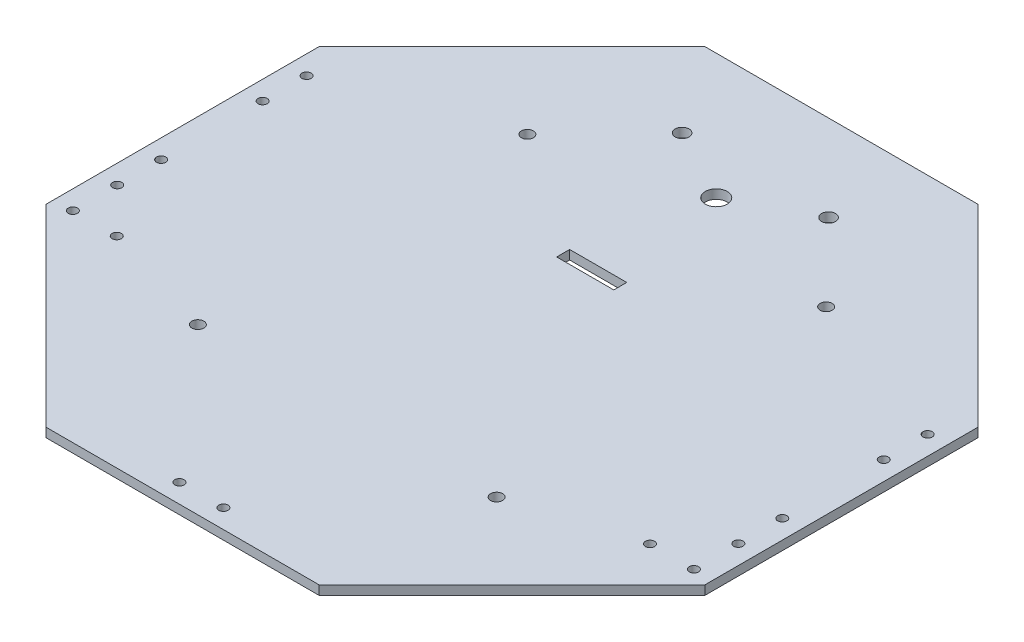
ISO-10303-21;
HEADER;
FILE_DESCRIPTION(('STEP AP214'),'2;1');
FILE_NAME('part.step','',(''),(''),'','','');
FILE_SCHEMA(('AUTOMOTIVE_DESIGN { 1 0 10303 214 1 1 1 1 }'));
ENDSEC;
DATA;
#1=APPLICATION_CONTEXT('core data for automotive mechanical design processes');
#2=APPLICATION_PROTOCOL_DEFINITION('international standard','automotive_design',2000,#1);
#3=PRODUCT_CONTEXT('',#1,'mechanical');
#4=PRODUCT('Part','Part','',(#3));
#5=PRODUCT_RELATED_PRODUCT_CATEGORY('part','',(#4));
#6=PRODUCT_DEFINITION_FORMATION('','',#4);
#7=PRODUCT_DEFINITION_CONTEXT('part definition',#1,'design');
#8=PRODUCT_DEFINITION('design','',#6,#7);
#9=PRODUCT_DEFINITION_SHAPE('','',#8);
#10=(LENGTH_UNIT() NAMED_UNIT(*) SI_UNIT(.MILLI.,.METRE.));
#11=(NAMED_UNIT(*) PLANE_ANGLE_UNIT() SI_UNIT($,.RADIAN.));
#12=(NAMED_UNIT(*) SI_UNIT($,.STERADIAN.) SOLID_ANGLE_UNIT());
#13=UNCERTAINTY_MEASURE_WITH_UNIT(LENGTH_MEASURE(1.E-05),#10,'distance_accuracy_value','');
#14=(GEOMETRIC_REPRESENTATION_CONTEXT(3) GLOBAL_UNCERTAINTY_ASSIGNED_CONTEXT((#13)) GLOBAL_UNIT_ASSIGNED_CONTEXT((#10,
#11,#12)) REPRESENTATION_CONTEXT('',''));
#15=CARTESIAN_POINT('',(0.,0.,0.));
#16=DIRECTION('',(0.,0.,1.));
#17=DIRECTION('',(1.,0.,0.));
#18=AXIS2_PLACEMENT_3D('',#15,#16,#17);
#19=CARTESIAN_POINT('',(0.,3.175,0.));
#20=DIRECTION('',(0.,-1.,0.));
#21=DIRECTION('',(0.,0.,-1.));
#22=AXIS2_PLACEMENT_3D('',#19,#20,#21);
#23=PLANE('',#22);
#24=CARTESIAN_POINT('',(76.2,3.175,-140.698010266211));
#25=DIRECTION('',(0.,1.,0.));
#26=DIRECTION('',(0.,0.,1.));
#27=AXIS2_PLACEMENT_3D('',#24,#25,#26);
#28=CIRCLE('',#27,3.81);
#29=CARTESIAN_POINT('',(76.2,3.175,-136.888010266211));
#30=VERTEX_POINT('',#29);
#31=EDGE_CURVE('E504',#30,#30,#28,.T.);
#32=ORIENTED_EDGE('',*,*,#31,.F.);
#33=EDGE_LOOP('',(#32));
#34=FACE_BOUND('',#33,.T.);
#35=CARTESIAN_POINT('',(50.8,3.175,-154.263560488309));
#36=DIRECTION('',(0.,1.,0.));
#37=DIRECTION('',(0.,0.,1.));
#38=AXIS2_PLACEMENT_3D('',#35,#36,#37);
#39=CIRCLE('',#38,2.41300000000001);
#40=CARTESIAN_POINT('',(50.8,3.175,-151.850560488309));
#41=VERTEX_POINT('',#40);
#42=EDGE_CURVE('E510',#41,#41,#39,.T.);
#43=ORIENTED_EDGE('',*,*,#42,.F.);
#44=EDGE_LOOP('',(#43));
#45=FACE_BOUND('',#44,.T.);
#46=CARTESIAN_POINT('',(101.6,3.175,-154.263560488309));
#47=DIRECTION('',(0.,1.,0.));
#48=DIRECTION('',(0.,0.,-1.));
#49=AXIS2_PLACEMENT_3D('',#46,#47,#48);
#50=CIRCLE('',#49,2.41300000000001);
#51=CARTESIAN_POINT('',(101.6,3.175,-156.676560488309));
#52=VERTEX_POINT('',#51);
#53=EDGE_CURVE('E146',#52,#52,#50,.T.);
#54=ORIENTED_EDGE('',*,*,#53,.F.);
#55=EDGE_LOOP('',(#54));
#56=FACE_BOUND('',#55,.T.);
#57=DIRECTION('',(1.,0.,0.));
#58=VECTOR('',#57,1.);
#59=CARTESIAN_POINT('',(86.1,3.175,-95.25));
#60=LINE('',#59,#58);
#61=CARTESIAN_POINT('',(66.3,3.175,-95.25));
#62=VERTEX_POINT('',#61);
#63=CARTESIAN_POINT('',(86.1,3.175,-95.25));
#64=VERTEX_POINT('',#63);
#65=EDGE_CURVE('E152',#62,#64,#60,.T.);
#66=ORIENTED_EDGE('',*,*,#65,.F.);
#67=DIRECTION('',(0.,0.,1.));
#68=VECTOR('',#67,1.);
#69=CARTESIAN_POINT('',(66.3,3.175,-99.75));
#70=LINE('',#69,#68);
#71=CARTESIAN_POINT('',(66.3,3.175,-99.75));
#72=VERTEX_POINT('',#71);
#73=EDGE_CURVE('E48',#72,#62,#70,.T.);
#74=ORIENTED_EDGE('',*,*,#73,.F.);
#75=DIRECTION('',(-1.,0.,0.));
#76=VECTOR('',#75,1.);
#77=CARTESIAN_POINT('',(86.1,3.175,-99.75));
#78=LINE('',#77,#76);
#79=CARTESIAN_POINT('',(86.1,3.175,-99.75));
#80=VERTEX_POINT('',#79);
#81=EDGE_CURVE('E140',#80,#72,#78,.T.);
#82=ORIENTED_EDGE('',*,*,#81,.F.);
#83=DIRECTION('',(0.,0.,-1.));
#84=VECTOR('',#83,1.);
#85=CARTESIAN_POINT('',(86.1,3.175,-99.75));
#86=LINE('',#85,#84);
#87=EDGE_CURVE('E143',#64,#80,#86,.T.);
#88=ORIENTED_EDGE('',*,*,#87,.F.);
#89=EDGE_LOOP('',(#66,#74,#82,#88));
#90=FACE_BOUND('',#89,.T.);
#91=CARTESIAN_POINT('',(-31.5214,3.175,-106.313101445706));
#92=DIRECTION('',(0.,1.,0.));
#93=DIRECTION('',(0.,0.,1.));
#94=AXIS2_PLACEMENT_3D('',#91,#92,#93);
#95=CIRCLE('',#94,1.59999999999999);
#96=CARTESIAN_POINT('',(-31.5214,3.175,-104.713101445706));
#97=VERTEX_POINT('',#96);
#98=EDGE_CURVE('E159',#97,#97,#95,.T.);
#99=ORIENTED_EDGE('',*,*,#98,.F.);
#100=EDGE_LOOP('',(#99));
#101=FACE_BOUND('',#100,.T.);
#102=CARTESIAN_POINT('',(-31.5214,3.175,-91.0731014457063));
#103=DIRECTION('',(0.,1.,0.));
#104=DIRECTION('',(0.,0.,1.));
#105=AXIS2_PLACEMENT_3D('',#102,#103,#104);
#106=CIRCLE('',#105,1.59999999999999);
#107=CARTESIAN_POINT('',(-31.5214,3.175,-89.4731014457063));
#108=VERTEX_POINT('',#107);
#109=EDGE_CURVE('E168',#108,#108,#106,.T.);
#110=ORIENTED_EDGE('',*,*,#109,.F.);
#111=EDGE_LOOP('',(#110));
#112=FACE_BOUND('',#111,.T.);
#113=CARTESIAN_POINT('',(-31.5214,3.175,-55.879553600485));
#114=DIRECTION('',(0.,1.,0.));
#115=DIRECTION('',(0.,0.,1.));
#116=AXIS2_PLACEMENT_3D('',#113,#114,#115);
#117=CIRCLE('',#116,1.59999999999999);
#118=CARTESIAN_POINT('',(-31.5214,3.175,-54.2795536004851));
#119=VERTEX_POINT('',#118);
#120=EDGE_CURVE('E174',#119,#119,#117,.T.);
#121=ORIENTED_EDGE('',*,*,#120,.F.);
#122=EDGE_LOOP('',(#121));
#123=FACE_BOUND('',#122,.T.);
#124=CARTESIAN_POINT('',(-31.5214,3.175,-40.6395536004851));
#125=DIRECTION('',(0.,1.,0.));
#126=DIRECTION('',(0.,0.,1.));
#127=AXIS2_PLACEMENT_3D('',#124,#125,#126);
#128=CIRCLE('',#127,1.59999999999999);
#129=CARTESIAN_POINT('',(-31.5214,3.175,-39.0395536004851));
#130=VERTEX_POINT('',#129);
#131=EDGE_CURVE('E180',#130,#130,#128,.T.);
#132=ORIENTED_EDGE('',*,*,#131,.F.);
#133=EDGE_LOOP('',(#132));
#134=FACE_BOUND('',#133,.T.);
#135=CARTESIAN_POINT('',(-31.5214,3.175,-25.2303351621829));
#136=DIRECTION('',(0.,1.,0.));
#137=DIRECTION('',(0.,0.,1.));
#138=AXIS2_PLACEMENT_3D('',#135,#136,#137);
#139=CIRCLE('',#138,1.59999999999999);
#140=CARTESIAN_POINT('',(-31.5214,3.175,-23.6303351621829));
#141=VERTEX_POINT('',#140);
#142=EDGE_CURVE('E186',#141,#141,#139,.T.);
#143=ORIENTED_EDGE('',*,*,#142,.F.);
#144=EDGE_LOOP('',(#143));
#145=FACE_BOUND('',#144,.T.);
#146=CARTESIAN_POINT('',(-16.2814,3.175,-25.2303351621829));
#147=DIRECTION('',(0.,1.,0.));
#148=DIRECTION('',(0.,0.,1.));
#149=AXIS2_PLACEMENT_3D('',#146,#147,#148);
#150=CIRCLE('',#149,1.59999999999999);
#151=CARTESIAN_POINT('',(-16.2814,3.175,-23.6303351621829));
#152=VERTEX_POINT('',#151);
#153=EDGE_CURVE('E192',#152,#152,#150,.T.);
#154=ORIENTED_EDGE('',*,*,#153,.F.);
#155=EDGE_LOOP('',(#154));
#156=FACE_BOUND('',#155,.T.);
#157=CARTESIAN_POINT('',(68.58,3.175,37.8714));
#158=DIRECTION('',(0.,1.,0.));
#159=DIRECTION('',(0.,0.,1.));
#160=AXIS2_PLACEMENT_3D('',#157,#158,#159);
#161=CIRCLE('',#160,1.59999999999999);
#162=CARTESIAN_POINT('',(68.58,3.175,39.4714));
#163=VERTEX_POINT('',#162);
#164=EDGE_CURVE('E198',#163,#163,#161,.T.);
#165=ORIENTED_EDGE('',*,*,#164,.F.);
#166=EDGE_LOOP('',(#165));
#167=FACE_BOUND('',#166,.T.);
#168=CARTESIAN_POINT('',(83.8200000000001,3.175,37.8714));
#169=DIRECTION('',(0.,1.,0.));
#170=DIRECTION('',(0.,0.,1.));
#171=AXIS2_PLACEMENT_3D('',#168,#169,#170);
#172=CIRCLE('',#171,1.59999999999999);
#173=CARTESIAN_POINT('',(83.8200000000001,3.175,39.4714));
#174=VERTEX_POINT('',#173);
#175=EDGE_CURVE('E204',#174,#174,#172,.T.);
#176=ORIENTED_EDGE('',*,*,#175,.F.);
#177=EDGE_LOOP('',(#176));
#178=FACE_BOUND('',#177,.T.);
#179=CARTESIAN_POINT('',(183.9214,3.175,-25.2303351621829));
#180=DIRECTION('',(0.,1.,0.));
#181=DIRECTION('',(0.,0.,1.));
#182=AXIS2_PLACEMENT_3D('',#179,#180,#181);
#183=CIRCLE('',#182,1.59999999999999);
#184=CARTESIAN_POINT('',(183.9214,3.175,-23.6303351621829));
#185=VERTEX_POINT('',#184);
#186=EDGE_CURVE('E210',#185,#185,#183,.T.);
#187=ORIENTED_EDGE('',*,*,#186,.F.);
#188=EDGE_LOOP('',(#187));
#189=FACE_BOUND('',#188,.T.);
#190=CARTESIAN_POINT('',(168.6814,3.175,-25.2303351621829));
#191=DIRECTION('',(0.,1.,0.));
#192=DIRECTION('',(0.,0.,1.));
#193=AXIS2_PLACEMENT_3D('',#190,#191,#192);
#194=CIRCLE('',#193,1.59999999999999);
#195=CARTESIAN_POINT('',(168.6814,3.175,-23.6303351621829));
#196=VERTEX_POINT('',#195);
#197=EDGE_CURVE('E216',#196,#196,#194,.T.);
#198=ORIENTED_EDGE('',*,*,#197,.F.);
#199=EDGE_LOOP('',(#198));
#200=FACE_BOUND('',#199,.T.);
#201=CARTESIAN_POINT('',(183.9214,3.175,-40.639553600485));
#202=DIRECTION('',(0.,1.,0.));
#203=DIRECTION('',(0.,0.,1.));
#204=AXIS2_PLACEMENT_3D('',#201,#202,#203);
#205=CIRCLE('',#204,1.59999999999999);
#206=CARTESIAN_POINT('',(183.9214,3.175,-39.039553600485));
#207=VERTEX_POINT('',#206);
#208=EDGE_CURVE('E222',#207,#207,#205,.T.);
#209=ORIENTED_EDGE('',*,*,#208,.F.);
#210=EDGE_LOOP('',(#209));
#211=FACE_BOUND('',#210,.T.);
#212=CARTESIAN_POINT('',(183.9214,3.175,-55.879553600485));
#213=DIRECTION('',(0.,1.,0.));
#214=DIRECTION('',(0.,0.,1.));
#215=AXIS2_PLACEMENT_3D('',#212,#213,#214);
#216=CIRCLE('',#215,1.59999999999999);
#217=CARTESIAN_POINT('',(183.9214,3.175,-54.279553600485));
#218=VERTEX_POINT('',#217);
#219=EDGE_CURVE('E228',#218,#218,#216,.T.);
#220=ORIENTED_EDGE('',*,*,#219,.F.);
#221=EDGE_LOOP('',(#220));
#222=FACE_BOUND('',#221,.T.);
#223=CARTESIAN_POINT('',(183.9214,3.175,-91.0731014457062));
#224=DIRECTION('',(0.,1.,0.));
#225=DIRECTION('',(0.,0.,1.));
#226=AXIS2_PLACEMENT_3D('',#223,#224,#225);
#227=CIRCLE('',#226,1.59999999999999);
#228=CARTESIAN_POINT('',(183.9214,3.175,-89.4731014457062));
#229=VERTEX_POINT('',#228);
#230=EDGE_CURVE('E234',#229,#229,#227,.T.);
#231=ORIENTED_EDGE('',*,*,#230,.F.);
#232=EDGE_LOOP('',(#231));
#233=FACE_BOUND('',#232,.T.);
#234=CARTESIAN_POINT('',(183.9214,3.175,-106.313101445706));
#235=DIRECTION('',(0.,1.,0.));
#236=DIRECTION('',(0.,0.,1.));
#237=AXIS2_PLACEMENT_3D('',#234,#235,#236);
#238=CIRCLE('',#237,1.59999999999999);
#239=CARTESIAN_POINT('',(183.9214,3.175,-104.713101445706));
#240=VERTEX_POINT('',#239);
#241=EDGE_CURVE('E240',#240,#240,#238,.T.);
#242=ORIENTED_EDGE('',*,*,#241,.F.);
#243=EDGE_LOOP('',(#242));
#244=FACE_BOUND('',#243,.T.);
#245=DIRECTION('',(-0.707106781186548,0.,-0.707106781186548));
#246=VECTOR('',#245,1.);
#247=CARTESIAN_POINT('',(123.544610179245,3.175,-184.15));
#248=LINE('',#247,#246);
#249=CARTESIAN_POINT('',(190.5,3.175,-117.194610179245));
#250=VERTEX_POINT('',#249);
#251=CARTESIAN_POINT('',(123.544610179245,3.175,-184.15));
#252=VERTEX_POINT('',#251);
#253=EDGE_CURVE('E271',#250,#252,#248,.T.);
#254=ORIENTED_EDGE('',*,*,#253,.T.);
#255=DIRECTION('',(-1.,0.,0.));
#256=VECTOR('',#255,1.);
#257=CARTESIAN_POINT('',(28.8553898207553,3.175,-184.15));
#258=LINE('',#257,#256);
#259=CARTESIAN_POINT('',(28.8553898207553,3.175,-184.15));
#260=VERTEX_POINT('',#259);
#261=EDGE_CURVE('E274',#252,#260,#258,.T.);
#262=ORIENTED_EDGE('',*,*,#261,.T.);
#263=DIRECTION('',(-0.707106781186548,0.,0.707106781186547));
#264=VECTOR('',#263,1.);
#265=CARTESIAN_POINT('',(28.8553898207553,3.175,-184.15));
#266=LINE('',#265,#264);
#267=CARTESIAN_POINT('',(-38.1,3.175,-117.194610179245));
#268=VERTEX_POINT('',#267);
#269=EDGE_CURVE('E277',#260,#268,#266,.T.);
#270=ORIENTED_EDGE('',*,*,#269,.T.);
#271=DIRECTION('',(0.,0.,1.));
#272=VECTOR('',#271,1.);
#273=CARTESIAN_POINT('',(-38.1,3.175,-22.5053898207552));
#274=LINE('',#273,#272);
#275=CARTESIAN_POINT('',(-38.1,3.175,-22.5053898207552));
#276=VERTEX_POINT('',#275);
#277=EDGE_CURVE('E279',#268,#276,#274,.T.);
#278=ORIENTED_EDGE('',*,*,#277,.T.);
#279=DIRECTION('',(0.707106781186548,0.,0.707106781186548));
#280=VECTOR('',#279,1.);
#281=CARTESIAN_POINT('',(-38.1,3.175,-22.5053898207552));
#282=LINE('',#281,#280);
#283=CARTESIAN_POINT('',(28.8553898207553,3.175,44.45));
#284=VERTEX_POINT('',#283);
#285=EDGE_CURVE('E281',#276,#284,#282,.T.);
#286=ORIENTED_EDGE('',*,*,#285,.T.);
#287=DIRECTION('',(1.,0.,0.));
#288=VECTOR('',#287,1.);
#289=CARTESIAN_POINT('',(28.8553898207553,3.175,44.45));
#290=LINE('',#289,#288);
#291=CARTESIAN_POINT('',(123.544610179245,3.175,44.45));
#292=VERTEX_POINT('',#291);
#293=EDGE_CURVE('E283',#284,#292,#290,.T.);
#294=ORIENTED_EDGE('',*,*,#293,.T.);
#295=DIRECTION('',(0.707106781186545,0.,-0.70710678118655));
#296=VECTOR('',#295,1.);
#297=CARTESIAN_POINT('',(131.544610179245,3.175,36.45));
#298=LINE('',#297,#296);
#299=CARTESIAN_POINT('',(190.5,3.175,-22.5053898207552));
#300=VERTEX_POINT('',#299);
#301=EDGE_CURVE('E285',#292,#300,#298,.T.);
#302=ORIENTED_EDGE('',*,*,#301,.T.);
#303=DIRECTION('',(0.,0.,-1.));
#304=VECTOR('',#303,1.);
#305=CARTESIAN_POINT('',(190.5,3.175,-22.5053898207552));
#306=LINE('',#305,#304);
#307=EDGE_CURVE('E287',#300,#250,#306,.T.);
#308=ORIENTED_EDGE('',*,*,#307,.T.);
#309=EDGE_LOOP('',(#254,#262,#270,#278,#286,#294,#302,#308));
#310=FACE_BOUND('',#309,.T.);
#311=CARTESIAN_POINT('',(24.384,3.175,-12.7));
#312=DIRECTION('',(0.,1.,0.));
#313=DIRECTION('',(0.,0.,1.));
#314=AXIS2_PLACEMENT_3D('',#311,#312,#313);
#315=CIRCLE('',#314,2.0828);
#316=CARTESIAN_POINT('',(24.384,3.175,-10.6172));
#317=VERTEX_POINT('',#316);
#318=EDGE_CURVE('E265',#317,#317,#315,.T.);
#319=ORIENTED_EDGE('',*,*,#318,.F.);
#320=EDGE_LOOP('',(#319));
#321=FACE_BOUND('',#320,.T.);
#322=CARTESIAN_POINT('',(128.016,3.175,-12.7));
#323=DIRECTION('',(0.,1.,0.));
#324=DIRECTION('',(0.,0.,-1.));
#325=AXIS2_PLACEMENT_3D('',#322,#323,#324);
#326=CIRCLE('',#325,2.08279999999999);
#327=CARTESIAN_POINT('',(128.016,3.175,-14.7828));
#328=VERTEX_POINT('',#327);
#329=EDGE_CURVE('E259',#328,#328,#326,.T.);
#330=ORIENTED_EDGE('',*,*,#329,.F.);
#331=EDGE_LOOP('',(#330));
#332=FACE_BOUND('',#331,.T.);
#333=CARTESIAN_POINT('',(128.016,3.175,-127.));
#334=DIRECTION('',(0.,1.,0.));
#335=DIRECTION('',(0.,0.,1.));
#336=AXIS2_PLACEMENT_3D('',#333,#334,#335);
#337=CIRCLE('',#336,2.08279999999998);
#338=CARTESIAN_POINT('',(128.016,3.175,-124.9172));
#339=VERTEX_POINT('',#338);
#340=EDGE_CURVE('E253',#339,#339,#337,.T.);
#341=ORIENTED_EDGE('',*,*,#340,.F.);
#342=EDGE_LOOP('',(#341));
#343=FACE_BOUND('',#342,.T.);
#344=CARTESIAN_POINT('',(24.384,3.175,-127.));
#345=DIRECTION('',(0.,1.,0.));
#346=DIRECTION('',(0.,0.,-1.));
#347=AXIS2_PLACEMENT_3D('',#344,#345,#346);
#348=CIRCLE('',#347,2.08279999999999);
#349=CARTESIAN_POINT('',(24.384,3.175,-129.0828));
#350=VERTEX_POINT('',#349);
#351=EDGE_CURVE('E247',#350,#350,#348,.T.);
#352=ORIENTED_EDGE('',*,*,#351,.F.);
#353=EDGE_LOOP('',(#352));
#354=FACE_BOUND('',#353,.T.);
#355=ADVANCED_FACE('F33',(#34,#45,#56,#90,#101,#112,#123,#134,#145,#156,#167,#178,#189,#200,
#211,#222,#233,#244,#310,#321,#332,#343,#354),#23,.F.);
#356=CARTESIAN_POINT('',(0.,0.,0.));
#357=DIRECTION('',(0.,-1.,0.));
#358=DIRECTION('',(0.,0.,-1.));
#359=AXIS2_PLACEMENT_3D('',#356,#357,#358);
#360=PLANE('',#359);
#361=CARTESIAN_POINT('',(76.2,0.,-140.698010266211));
#362=DIRECTION('',(0.,1.,0.));
#363=DIRECTION('',(0.,0.,1.));
#364=AXIS2_PLACEMENT_3D('',#361,#362,#363);
#365=CIRCLE('',#364,3.81);
#366=CARTESIAN_POINT('',(76.2,0.,-136.888010266211));
#367=VERTEX_POINT('',#366);
#368=EDGE_CURVE('E502',#367,#367,#365,.T.);
#369=ORIENTED_EDGE('',*,*,#368,.T.);
#370=EDGE_LOOP('',(#369));
#371=FACE_BOUND('',#370,.T.);
#372=CARTESIAN_POINT('',(50.8,0.,-154.263560488309));
#373=DIRECTION('',(0.,1.,0.));
#374=DIRECTION('',(0.,0.,1.));
#375=AXIS2_PLACEMENT_3D('',#372,#373,#374);
#376=CIRCLE('',#375,2.41300000000001);
#377=CARTESIAN_POINT('',(50.8,0.,-151.850560488309));
#378=VERTEX_POINT('',#377);
#379=EDGE_CURVE('E153',#378,#378,#376,.T.);
#380=ORIENTED_EDGE('',*,*,#379,.T.);
#381=EDGE_LOOP('',(#380));
#382=FACE_BOUND('',#381,.T.);
#383=CARTESIAN_POINT('',(101.6,0.,-154.263560488309));
#384=DIRECTION('',(0.,1.,0.));
#385=DIRECTION('',(0.,0.,-1.));
#386=AXIS2_PLACEMENT_3D('',#383,#384,#385);
#387=CIRCLE('',#386,2.41300000000001);
#388=CARTESIAN_POINT('',(101.6,0.,-156.676560488309));
#389=VERTEX_POINT('',#388);
#390=EDGE_CURVE('E512',#389,#389,#387,.T.);
#391=ORIENTED_EDGE('',*,*,#390,.T.);
#392=EDGE_LOOP('',(#391));
#393=FACE_BOUND('',#392,.T.);
#394=DIRECTION('',(0.,0.,1.));
#395=VECTOR('',#394,1.);
#396=CARTESIAN_POINT('',(66.3,0.,-99.75));
#397=LINE('',#396,#395);
#398=CARTESIAN_POINT('',(66.3,0.,-99.75));
#399=VERTEX_POINT('',#398);
#400=CARTESIAN_POINT('',(66.3,0.,-95.25));
#401=VERTEX_POINT('',#400);
#402=EDGE_CURVE('E124',#399,#401,#397,.T.);
#403=ORIENTED_EDGE('',*,*,#402,.T.);
#404=DIRECTION('',(1.,0.,0.));
#405=VECTOR('',#404,1.);
#406=CARTESIAN_POINT('',(86.1,0.,-95.25));
#407=LINE('',#406,#405);
#408=CARTESIAN_POINT('',(86.1,0.,-95.25));
#409=VERTEX_POINT('',#408);
#410=EDGE_CURVE('E133',#401,#409,#407,.T.);
#411=ORIENTED_EDGE('',*,*,#410,.T.);
#412=DIRECTION('',(0.,0.,-1.));
#413=VECTOR('',#412,1.);
#414=CARTESIAN_POINT('',(86.1,0.,-99.75));
#415=LINE('',#414,#413);
#416=CARTESIAN_POINT('',(86.1,0.,-99.75));
#417=VERTEX_POINT('',#416);
#418=EDGE_CURVE('E56',#409,#417,#415,.T.);
#419=ORIENTED_EDGE('',*,*,#418,.T.);
#420=DIRECTION('',(-1.,0.,0.));
#421=VECTOR('',#420,1.);
#422=CARTESIAN_POINT('',(86.1,0.,-99.75));
#423=LINE('',#422,#421);
#424=EDGE_CURVE('E130',#417,#399,#423,.T.);
#425=ORIENTED_EDGE('',*,*,#424,.T.);
#426=EDGE_LOOP('',(#403,#411,#419,#425));
#427=FACE_BOUND('',#426,.T.);
#428=CARTESIAN_POINT('',(-31.5214,0.,-106.313101445706));
#429=DIRECTION('',(0.,1.,0.));
#430=DIRECTION('',(0.,0.,1.));
#431=AXIS2_PLACEMENT_3D('',#428,#429,#430);
#432=CIRCLE('',#431,1.6);
#433=CARTESIAN_POINT('',(-31.5214,0.,-104.713101445706));
#434=VERTEX_POINT('',#433);
#435=EDGE_CURVE('E165',#434,#434,#432,.T.);
#436=ORIENTED_EDGE('',*,*,#435,.T.);
#437=EDGE_LOOP('',(#436));
#438=FACE_BOUND('',#437,.T.);
#439=CARTESIAN_POINT('',(-31.5214,0.,-91.0731014457063));
#440=DIRECTION('',(0.,1.,0.));
#441=DIRECTION('',(0.,0.,1.));
#442=AXIS2_PLACEMENT_3D('',#439,#440,#441);
#443=CIRCLE('',#442,1.6);
#444=CARTESIAN_POINT('',(-31.5214,0.,-89.4731014457063));
#445=VERTEX_POINT('',#444);
#446=EDGE_CURVE('E171',#445,#445,#443,.T.);
#447=ORIENTED_EDGE('',*,*,#446,.T.);
#448=EDGE_LOOP('',(#447));
#449=FACE_BOUND('',#448,.T.);
#450=CARTESIAN_POINT('',(-31.5214,0.,-55.879553600485));
#451=DIRECTION('',(0.,1.,0.));
#452=DIRECTION('',(0.,0.,1.));
#453=AXIS2_PLACEMENT_3D('',#450,#451,#452);
#454=CIRCLE('',#453,1.6);
#455=CARTESIAN_POINT('',(-31.5214,0.,-54.279553600485));
#456=VERTEX_POINT('',#455);
#457=EDGE_CURVE('E177',#456,#456,#454,.T.);
#458=ORIENTED_EDGE('',*,*,#457,.T.);
#459=EDGE_LOOP('',(#458));
#460=FACE_BOUND('',#459,.T.);
#461=CARTESIAN_POINT('',(-31.5214,0.,-40.6395536004851));
#462=DIRECTION('',(0.,1.,0.));
#463=DIRECTION('',(0.,0.,1.));
#464=AXIS2_PLACEMENT_3D('',#461,#462,#463);
#465=CIRCLE('',#464,1.6);
#466=CARTESIAN_POINT('',(-31.5214,0.,-39.0395536004851));
#467=VERTEX_POINT('',#466);
#468=EDGE_CURVE('E183',#467,#467,#465,.T.);
#469=ORIENTED_EDGE('',*,*,#468,.T.);
#470=EDGE_LOOP('',(#469));
#471=FACE_BOUND('',#470,.T.);
#472=CARTESIAN_POINT('',(-31.5214,0.,-25.2303351621829));
#473=DIRECTION('',(0.,1.,0.));
#474=DIRECTION('',(0.,0.,1.));
#475=AXIS2_PLACEMENT_3D('',#472,#473,#474);
#476=CIRCLE('',#475,1.6);
#477=CARTESIAN_POINT('',(-31.5214,0.,-23.6303351621829));
#478=VERTEX_POINT('',#477);
#479=EDGE_CURVE('E189',#478,#478,#476,.T.);
#480=ORIENTED_EDGE('',*,*,#479,.T.);
#481=EDGE_LOOP('',(#480));
#482=FACE_BOUND('',#481,.T.);
#483=CARTESIAN_POINT('',(-16.2814,0.,-25.2303351621829));
#484=DIRECTION('',(0.,1.,0.));
#485=DIRECTION('',(0.,0.,1.));
#486=AXIS2_PLACEMENT_3D('',#483,#484,#485);
#487=CIRCLE('',#486,1.6);
#488=CARTESIAN_POINT('',(-16.2814,0.,-23.6303351621829));
#489=VERTEX_POINT('',#488);
#490=EDGE_CURVE('E195',#489,#489,#487,.T.);
#491=ORIENTED_EDGE('',*,*,#490,.T.);
#492=EDGE_LOOP('',(#491));
#493=FACE_BOUND('',#492,.T.);
#494=CARTESIAN_POINT('',(68.58,0.,37.8714));
#495=DIRECTION('',(0.,1.,0.));
#496=DIRECTION('',(0.,0.,1.));
#497=AXIS2_PLACEMENT_3D('',#494,#495,#496);
#498=CIRCLE('',#497,1.6);
#499=CARTESIAN_POINT('',(68.58,0.,39.4714));
#500=VERTEX_POINT('',#499);
#501=EDGE_CURVE('E201',#500,#500,#498,.T.);
#502=ORIENTED_EDGE('',*,*,#501,.T.);
#503=EDGE_LOOP('',(#502));
#504=FACE_BOUND('',#503,.T.);
#505=CARTESIAN_POINT('',(83.8200000000001,0.,37.8714));
#506=DIRECTION('',(0.,1.,0.));
#507=DIRECTION('',(0.,0.,1.));
#508=AXIS2_PLACEMENT_3D('',#505,#506,#507);
#509=CIRCLE('',#508,1.6);
#510=CARTESIAN_POINT('',(83.8200000000001,0.,39.4714));
#511=VERTEX_POINT('',#510);
#512=EDGE_CURVE('E207',#511,#511,#509,.T.);
#513=ORIENTED_EDGE('',*,*,#512,.T.);
#514=EDGE_LOOP('',(#513));
#515=FACE_BOUND('',#514,.T.);
#516=CARTESIAN_POINT('',(183.9214,0.,-25.2303351621829));
#517=DIRECTION('',(0.,1.,0.));
#518=DIRECTION('',(0.,0.,1.));
#519=AXIS2_PLACEMENT_3D('',#516,#517,#518);
#520=CIRCLE('',#519,1.59999999999999);
#521=CARTESIAN_POINT('',(183.9214,0.,-23.6303351621829));
#522=VERTEX_POINT('',#521);
#523=EDGE_CURVE('E213',#522,#522,#520,.T.);
#524=ORIENTED_EDGE('',*,*,#523,.T.);
#525=EDGE_LOOP('',(#524));
#526=FACE_BOUND('',#525,.T.);
#527=CARTESIAN_POINT('',(168.6814,0.,-25.2303351621829));
#528=DIRECTION('',(0.,1.,0.));
#529=DIRECTION('',(0.,0.,1.));
#530=AXIS2_PLACEMENT_3D('',#527,#528,#529);
#531=CIRCLE('',#530,1.59999999999999);
#532=CARTESIAN_POINT('',(168.6814,0.,-23.6303351621829));
#533=VERTEX_POINT('',#532);
#534=EDGE_CURVE('E219',#533,#533,#531,.T.);
#535=ORIENTED_EDGE('',*,*,#534,.T.);
#536=EDGE_LOOP('',(#535));
#537=FACE_BOUND('',#536,.T.);
#538=CARTESIAN_POINT('',(183.9214,0.,-40.639553600485));
#539=DIRECTION('',(0.,1.,0.));
#540=DIRECTION('',(0.,0.,1.));
#541=AXIS2_PLACEMENT_3D('',#538,#539,#540);
#542=CIRCLE('',#541,1.59999999999999);
#543=CARTESIAN_POINT('',(183.9214,0.,-39.039553600485));
#544=VERTEX_POINT('',#543);
#545=EDGE_CURVE('E225',#544,#544,#542,.T.);
#546=ORIENTED_EDGE('',*,*,#545,.T.);
#547=EDGE_LOOP('',(#546));
#548=FACE_BOUND('',#547,.T.);
#549=CARTESIAN_POINT('',(183.9214,0.,-55.879553600485));
#550=DIRECTION('',(0.,1.,0.));
#551=DIRECTION('',(0.,0.,1.));
#552=AXIS2_PLACEMENT_3D('',#549,#550,#551);
#553=CIRCLE('',#552,1.59999999999999);
#554=CARTESIAN_POINT('',(183.9214,0.,-54.279553600485));
#555=VERTEX_POINT('',#554);
#556=EDGE_CURVE('E231',#555,#555,#553,.T.);
#557=ORIENTED_EDGE('',*,*,#556,.T.);
#558=EDGE_LOOP('',(#557));
#559=FACE_BOUND('',#558,.T.);
#560=CARTESIAN_POINT('',(183.9214,0.,-91.0731014457062));
#561=DIRECTION('',(0.,1.,0.));
#562=DIRECTION('',(0.,0.,1.));
#563=AXIS2_PLACEMENT_3D('',#560,#561,#562);
#564=CIRCLE('',#563,1.59999999999999);
#565=CARTESIAN_POINT('',(183.9214,0.,-89.4731014457062));
#566=VERTEX_POINT('',#565);
#567=EDGE_CURVE('E237',#566,#566,#564,.T.);
#568=ORIENTED_EDGE('',*,*,#567,.T.);
#569=EDGE_LOOP('',(#568));
#570=FACE_BOUND('',#569,.T.);
#571=CARTESIAN_POINT('',(183.9214,0.,-106.313101445706));
#572=DIRECTION('',(0.,1.,0.));
#573=DIRECTION('',(0.,0.,1.));
#574=AXIS2_PLACEMENT_3D('',#571,#572,#573);
#575=CIRCLE('',#574,1.59999999999999);
#576=CARTESIAN_POINT('',(183.9214,0.,-104.713101445706));
#577=VERTEX_POINT('',#576);
#578=EDGE_CURVE('E243',#577,#577,#575,.T.);
#579=ORIENTED_EDGE('',*,*,#578,.T.);
#580=EDGE_LOOP('',(#579));
#581=FACE_BOUND('',#580,.T.);
#582=CARTESIAN_POINT('',(128.016,0.,-127.));
#583=DIRECTION('',(0.,1.,0.));
#584=DIRECTION('',(0.,0.,1.));
#585=AXIS2_PLACEMENT_3D('',#582,#583,#584);
#586=CIRCLE('',#585,2.08279999999998);
#587=CARTESIAN_POINT('',(128.016,0.,-124.9172));
#588=VERTEX_POINT('',#587);
#589=EDGE_CURVE('E250',#588,#588,#586,.T.);
#590=ORIENTED_EDGE('',*,*,#589,.T.);
#591=EDGE_LOOP('',(#590));
#592=FACE_BOUND('',#591,.T.);
#593=CARTESIAN_POINT('',(24.384,0.,-12.7));
#594=DIRECTION('',(0.,1.,0.));
#595=DIRECTION('',(0.,0.,1.));
#596=AXIS2_PLACEMENT_3D('',#593,#594,#595);
#597=CIRCLE('',#596,2.0828);
#598=CARTESIAN_POINT('',(24.384,0.,-10.6172));
#599=VERTEX_POINT('',#598);
#600=EDGE_CURVE('E262',#599,#599,#597,.T.);
#601=ORIENTED_EDGE('',*,*,#600,.T.);
#602=EDGE_LOOP('',(#601));
#603=FACE_BOUND('',#602,.T.);
#604=DIRECTION('',(-1.,0.,0.));
#605=VECTOR('',#604,1.);
#606=CARTESIAN_POINT('',(28.8553898207553,0.,-184.15));
#607=LINE('',#606,#605);
#608=CARTESIAN_POINT('',(123.544610179245,0.,-184.15));
#609=VERTEX_POINT('',#608);
#610=CARTESIAN_POINT('',(28.8553898207553,0.,-184.15));
#611=VERTEX_POINT('',#610);
#612=EDGE_CURVE('E268',#609,#611,#607,.T.);
#613=ORIENTED_EDGE('',*,*,#612,.F.);
#614=DIRECTION('',(-0.707106781186546,0.,-0.707106781186549));
#615=VECTOR('',#614,1.);
#616=CARTESIAN_POINT('',(182.5,0.,-125.194610179245));
#617=LINE('',#616,#615);
#618=CARTESIAN_POINT('',(190.5,0.,-117.194610179245));
#619=VERTEX_POINT('',#618);
#620=EDGE_CURVE('E275',#619,#609,#617,.T.);
#621=ORIENTED_EDGE('',*,*,#620,.F.);
#622=DIRECTION('',(0.,0.,-1.));
#623=VECTOR('',#622,1.);
#624=CARTESIAN_POINT('',(190.5,0.,-22.5053898207552));
#625=LINE('',#624,#623);
#626=CARTESIAN_POINT('',(190.5,0.,-22.5053898207552));
#627=VERTEX_POINT('',#626);
#628=EDGE_CURVE('E305',#627,#619,#625,.T.);
#629=ORIENTED_EDGE('',*,*,#628,.F.);
#630=DIRECTION('',(0.707106781186545,0.,-0.70710678118655));
#631=VECTOR('',#630,1.);
#632=CARTESIAN_POINT('',(190.5,0.,-22.5053898207552));
#633=LINE('',#632,#631);
#634=CARTESIAN_POINT('',(123.544610179245,0.,44.45));
#635=VERTEX_POINT('',#634);
#636=EDGE_CURVE('E303',#635,#627,#633,.T.);
#637=ORIENTED_EDGE('',*,*,#636,.F.);
#638=DIRECTION('',(1.,0.,0.));
#639=VECTOR('',#638,1.);
#640=CARTESIAN_POINT('',(28.8553898207553,0.,44.45));
#641=LINE('',#640,#639);
#642=CARTESIAN_POINT('',(28.8553898207553,0.,44.45));
#643=VERTEX_POINT('',#642);
#644=EDGE_CURVE('E300',#643,#635,#641,.T.);
#645=ORIENTED_EDGE('',*,*,#644,.F.);
#646=DIRECTION('',(0.707106781186548,0.,0.707106781186547));
#647=VECTOR('',#646,1.);
#648=CARTESIAN_POINT('',(20.8553898207552,0.,36.45));
#649=LINE('',#648,#647);
#650=CARTESIAN_POINT('',(-38.1,0.,-22.5053898207552));
#651=VERTEX_POINT('',#650);
#652=EDGE_CURVE('E298',#651,#643,#649,.T.);
#653=ORIENTED_EDGE('',*,*,#652,.F.);
#654=DIRECTION('',(0.,0.,1.));
#655=VECTOR('',#654,1.);
#656=CARTESIAN_POINT('',(-38.1,0.,-22.5053898207552));
#657=LINE('',#656,#655);
#658=CARTESIAN_POINT('',(-38.1,0.,-117.194610179245));
#659=VERTEX_POINT('',#658);
#660=EDGE_CURVE('E295',#659,#651,#657,.T.);
#661=ORIENTED_EDGE('',*,*,#660,.F.);
#662=DIRECTION('',(-0.707106781186549,0.,0.707106781186547));
#663=VECTOR('',#662,1.);
#664=CARTESIAN_POINT('',(-30.1,0.,-125.194610179245));
#665=LINE('',#664,#663);
#666=EDGE_CURVE('E293',#611,#659,#665,.T.);
#667=ORIENTED_EDGE('',*,*,#666,.F.);
#668=EDGE_LOOP('',(#613,#621,#629,#637,#645,#653,#661,#667));
#669=FACE_BOUND('',#668,.T.);
#670=CARTESIAN_POINT('',(128.016,0.,-12.7));
#671=DIRECTION('',(0.,1.,0.));
#672=DIRECTION('',(0.,0.,-1.));
#673=AXIS2_PLACEMENT_3D('',#670,#671,#672);
#674=CIRCLE('',#673,2.08279999999999);
#675=CARTESIAN_POINT('',(128.016,0.,-14.7828));
#676=VERTEX_POINT('',#675);
#677=EDGE_CURVE('E256',#676,#676,#674,.T.);
#678=ORIENTED_EDGE('',*,*,#677,.T.);
#679=EDGE_LOOP('',(#678));
#680=FACE_BOUND('',#679,.T.);
#681=CARTESIAN_POINT('',(24.384,0.,-127.));
#682=DIRECTION('',(0.,1.,0.));
#683=DIRECTION('',(0.,0.,-1.));
#684=AXIS2_PLACEMENT_3D('',#681,#682,#683);
#685=CIRCLE('',#684,2.08279999999999);
#686=CARTESIAN_POINT('',(24.384,0.,-129.0828));
#687=VERTEX_POINT('',#686);
#688=EDGE_CURVE('E246',#687,#687,#685,.T.);
#689=ORIENTED_EDGE('',*,*,#688,.T.);
#690=EDGE_LOOP('',(#689));
#691=FACE_BOUND('',#690,.T.);
#692=ADVANCED_FACE('F137',(#371,#382,#393,#427,#438,#449,#460,#471,#482,#493,#504,#515,#526,
#537,#548,#559,#570,#581,#592,#603,#669,#680,#691),#360,.T.);
#693=CARTESIAN_POINT('',(28.8553898207553,3.175,-184.15));
#694=DIRECTION('',(0.,0.,1.));
#695=DIRECTION('',(1.,0.,0.));
#696=AXIS2_PLACEMENT_3D('',#693,#694,#695);
#697=PLANE('',#696);
#698=ORIENTED_EDGE('',*,*,#612,.T.);
#699=DIRECTION('',(0.,-1.,0.));
#700=VECTOR('',#699,1.);
#701=CARTESIAN_POINT('',(28.8553898207553,3.175,-184.15));
#702=LINE('',#701,#700);
#703=EDGE_CURVE('E41',#260,#611,#702,.T.);
#704=ORIENTED_EDGE('',*,*,#703,.F.);
#705=ORIENTED_EDGE('',*,*,#261,.F.);
#706=DIRECTION('',(0.,-1.,0.));
#707=VECTOR('',#706,1.);
#708=CARTESIAN_POINT('',(123.544610179245,3.175,-184.15));
#709=LINE('',#708,#707);
#710=EDGE_CURVE('E11',#252,#609,#709,.T.);
#711=ORIENTED_EDGE('',*,*,#710,.T.);
#712=EDGE_LOOP('',(#698,#704,#705,#711));
#713=FACE_BOUND('',#712,.T.);
#714=ADVANCED_FACE('F35',(#713),#697,.F.);
#715=CARTESIAN_POINT('',(-30.1,3.175,-125.194610179245));
#716=DIRECTION('',(0.707106781186547,0.,0.707106781186548));
#717=DIRECTION('',(0.707106781186548,0.,-0.707106781186547));
#718=AXIS2_PLACEMENT_3D('',#715,#716,#717);
#719=PLANE('',#718);
#720=ORIENTED_EDGE('',*,*,#666,.T.);
#721=DIRECTION('',(0.,-1.,0.));
#722=VECTOR('',#721,1.);
#723=CARTESIAN_POINT('',(-38.1,3.175,-117.194610179245));
#724=LINE('',#723,#722);
#725=EDGE_CURVE('E323',#268,#659,#724,.T.);
#726=ORIENTED_EDGE('',*,*,#725,.F.);
#727=ORIENTED_EDGE('',*,*,#269,.F.);
#728=ORIENTED_EDGE('',*,*,#703,.T.);
#729=EDGE_LOOP('',(#720,#726,#727,#728));
#730=FACE_BOUND('',#729,.T.);
#731=ADVANCED_FACE('F329',(#730),#719,.F.);
#732=CARTESIAN_POINT('',(-38.1,3.175,-22.5053898207552));
#733=DIRECTION('',(1.,0.,0.));
#734=DIRECTION('',(0.,0.,-1.));
#735=AXIS2_PLACEMENT_3D('',#732,#733,#734);
#736=PLANE('',#735);
#737=ORIENTED_EDGE('',*,*,#660,.T.);
#738=DIRECTION('',(0.,-1.,0.));
#739=VECTOR('',#738,1.);
#740=CARTESIAN_POINT('',(-38.1,3.175,-22.5053898207552));
#741=LINE('',#740,#739);
#742=EDGE_CURVE('E320',#276,#651,#741,.T.);
#743=ORIENTED_EDGE('',*,*,#742,.F.);
#744=ORIENTED_EDGE('',*,*,#277,.F.);
#745=ORIENTED_EDGE('',*,*,#725,.T.);
#746=EDGE_LOOP('',(#737,#743,#744,#745));
#747=FACE_BOUND('',#746,.T.);
#748=ADVANCED_FACE('F341',(#747),#736,.F.);
#749=CARTESIAN_POINT('',(20.8553898207552,3.175,36.45));
#750=DIRECTION('',(0.707106781186547,0.,-0.707106781186548));
#751=DIRECTION('',(-0.707106781186548,0.,-0.707106781186547));
#752=AXIS2_PLACEMENT_3D('',#749,#750,#751);
#753=PLANE('',#752);
#754=ORIENTED_EDGE('',*,*,#652,.T.);
#755=DIRECTION('',(0.,-1.,0.));
#756=VECTOR('',#755,1.);
#757=CARTESIAN_POINT('',(28.8553898207553,3.175,44.45));
#758=LINE('',#757,#756);
#759=EDGE_CURVE('E317',#284,#643,#758,.T.);
#760=ORIENTED_EDGE('',*,*,#759,.F.);
#761=ORIENTED_EDGE('',*,*,#285,.F.);
#762=ORIENTED_EDGE('',*,*,#742,.T.);
#763=EDGE_LOOP('',(#754,#760,#761,#762));
#764=FACE_BOUND('',#763,.T.);
#765=ADVANCED_FACE('F345',(#764),#753,.F.);
#766=CARTESIAN_POINT('',(28.8553898207553,3.175,44.45));
#767=DIRECTION('',(0.,0.,-1.));
#768=DIRECTION('',(-1.,0.,0.));
#769=AXIS2_PLACEMENT_3D('',#766,#767,#768);
#770=PLANE('',#769);
#771=ORIENTED_EDGE('',*,*,#644,.T.);
#772=DIRECTION('',(0.,-1.,0.));
#773=VECTOR('',#772,1.);
#774=CARTESIAN_POINT('',(123.544610179245,3.175,44.45));
#775=LINE('',#774,#773);
#776=EDGE_CURVE('E314',#292,#635,#775,.T.);
#777=ORIENTED_EDGE('',*,*,#776,.F.);
#778=ORIENTED_EDGE('',*,*,#293,.F.);
#779=ORIENTED_EDGE('',*,*,#759,.T.);
#780=EDGE_LOOP('',(#771,#777,#778,#779));
#781=FACE_BOUND('',#780,.T.);
#782=ADVANCED_FACE('F360',(#781),#770,.F.);
#783=CARTESIAN_POINT('',(190.5,3.175,-22.5053898207552));
#784=DIRECTION('',(-0.70710678118655,0.,-0.707106781186545));
#785=DIRECTION('',(-0.707106781186545,0.,0.70710678118655));
#786=AXIS2_PLACEMENT_3D('',#783,#784,#785);
#787=PLANE('',#786);
#788=ORIENTED_EDGE('',*,*,#636,.T.);
#789=DIRECTION('',(0.,-1.,0.));
#790=VECTOR('',#789,1.);
#791=CARTESIAN_POINT('',(190.5,3.175,-22.5053898207552));
#792=LINE('',#791,#790);
#793=EDGE_CURVE('E311',#300,#627,#792,.T.);
#794=ORIENTED_EDGE('',*,*,#793,.F.);
#795=ORIENTED_EDGE('',*,*,#301,.F.);
#796=ORIENTED_EDGE('',*,*,#776,.T.);
#797=EDGE_LOOP('',(#788,#794,#795,#796));
#798=FACE_BOUND('',#797,.T.);
#799=ADVANCED_FACE('F362',(#798),#787,.F.);
#800=CARTESIAN_POINT('',(190.5,3.175,-22.5053898207552));
#801=DIRECTION('',(-1.,0.,0.));
#802=DIRECTION('',(0.,0.,1.));
#803=AXIS2_PLACEMENT_3D('',#800,#801,#802);
#804=PLANE('',#803);
#805=ORIENTED_EDGE('',*,*,#628,.T.);
#806=DIRECTION('',(0.,-1.,0.));
#807=VECTOR('',#806,1.);
#808=CARTESIAN_POINT('',(190.5,3.175,-117.194610179245));
#809=LINE('',#808,#807);
#810=EDGE_CURVE('E290',#250,#619,#809,.T.);
#811=ORIENTED_EDGE('',*,*,#810,.F.);
#812=ORIENTED_EDGE('',*,*,#307,.F.);
#813=ORIENTED_EDGE('',*,*,#793,.T.);
#814=EDGE_LOOP('',(#805,#811,#812,#813));
#815=FACE_BOUND('',#814,.T.);
#816=ADVANCED_FACE('F356',(#815),#804,.F.);
#817=CARTESIAN_POINT('',(182.5,3.175,-125.194610179245));
#818=DIRECTION('',(-0.707106781186549,0.,0.707106781186546));
#819=DIRECTION('',(0.707106781186546,0.,0.707106781186549));
#820=AXIS2_PLACEMENT_3D('',#817,#818,#819);
#821=PLANE('',#820);
#822=ORIENTED_EDGE('',*,*,#620,.T.);
#823=ORIENTED_EDGE('',*,*,#710,.F.);
#824=ORIENTED_EDGE('',*,*,#253,.F.);
#825=ORIENTED_EDGE('',*,*,#810,.T.);
#826=EDGE_LOOP('',(#822,#823,#824,#825));
#827=FACE_BOUND('',#826,.T.);
#828=ADVANCED_FACE('F354',(#827),#821,.F.);
#829=CARTESIAN_POINT('',(24.384,3.175,-12.7));
#830=DIRECTION('',(0.,-1.,0.));
#831=DIRECTION('',(0.,0.,-1.));
#832=AXIS2_PLACEMENT_3D('',#829,#830,#831);
#833=CYLINDRICAL_SURFACE('',#832,2.0828);
#834=ORIENTED_EDGE('',*,*,#318,.T.);
#835=EDGE_LOOP('',(#834));
#836=FACE_BOUND('',#835,.T.);
#837=ORIENTED_EDGE('',*,*,#600,.F.);
#838=EDGE_LOOP('',(#837));
#839=FACE_BOUND('',#838,.T.);
#840=ADVANCED_FACE('F382',(#836,#839),#833,.F.);
#841=CARTESIAN_POINT('',(128.016,3.175,-12.7));
#842=DIRECTION('',(0.,-1.,0.));
#843=DIRECTION('',(0.,0.,-1.));
#844=AXIS2_PLACEMENT_3D('',#841,#842,#843);
#845=CYLINDRICAL_SURFACE('',#844,2.08279999999999);
#846=ORIENTED_EDGE('',*,*,#329,.T.);
#847=EDGE_LOOP('',(#846));
#848=FACE_BOUND('',#847,.T.);
#849=ORIENTED_EDGE('',*,*,#677,.F.);
#850=EDGE_LOOP('',(#849));
#851=FACE_BOUND('',#850,.T.);
#852=ADVANCED_FACE('F389',(#848,#851),#845,.F.);
#853=CARTESIAN_POINT('',(128.016,3.175,-127.));
#854=DIRECTION('',(0.,-1.,0.));
#855=DIRECTION('',(0.,0.,-1.));
#856=AXIS2_PLACEMENT_3D('',#853,#854,#855);
#857=CYLINDRICAL_SURFACE('',#856,2.08279999999998);
#858=ORIENTED_EDGE('',*,*,#340,.T.);
#859=EDGE_LOOP('',(#858));
#860=FACE_BOUND('',#859,.T.);
#861=ORIENTED_EDGE('',*,*,#589,.F.);
#862=EDGE_LOOP('',(#861));
#863=FACE_BOUND('',#862,.T.);
#864=ADVANCED_FACE('F394',(#860,#863),#857,.F.);
#865=CARTESIAN_POINT('',(24.384,3.175,-127.));
#866=DIRECTION('',(0.,-1.,0.));
#867=DIRECTION('',(0.,0.,-1.));
#868=AXIS2_PLACEMENT_3D('',#865,#866,#867);
#869=CYLINDRICAL_SURFACE('',#868,2.08279999999999);
#870=ORIENTED_EDGE('',*,*,#351,.T.);
#871=EDGE_LOOP('',(#870));
#872=FACE_BOUND('',#871,.T.);
#873=ORIENTED_EDGE('',*,*,#688,.F.);
#874=EDGE_LOOP('',(#873));
#875=FACE_BOUND('',#874,.T.);
#876=ADVANCED_FACE('F407',(#872,#875),#869,.F.);
#877=CARTESIAN_POINT('',(183.9214,3.175,-106.313101445706));
#878=DIRECTION('',(0.,1.,0.));
#879=DIRECTION('',(0.,0.,1.));
#880=AXIS2_PLACEMENT_3D('',#877,#878,#879);
#881=CYLINDRICAL_SURFACE('',#880,1.59999999999999);
#882=ORIENTED_EDGE('',*,*,#578,.F.);
#883=EDGE_LOOP('',(#882));
#884=FACE_BOUND('',#883,.T.);
#885=ORIENTED_EDGE('',*,*,#241,.T.);
#886=EDGE_LOOP('',(#885));
#887=FACE_BOUND('',#886,.T.);
#888=ADVANCED_FACE('F410',(#884,#887),#881,.F.);
#889=CARTESIAN_POINT('',(183.9214,3.175,-91.0731014457062));
#890=DIRECTION('',(0.,1.,0.));
#891=DIRECTION('',(0.,0.,1.));
#892=AXIS2_PLACEMENT_3D('',#889,#890,#891);
#893=CYLINDRICAL_SURFACE('',#892,1.59999999999999);
#894=ORIENTED_EDGE('',*,*,#567,.F.);
#895=EDGE_LOOP('',(#894));
#896=FACE_BOUND('',#895,.T.);
#897=ORIENTED_EDGE('',*,*,#230,.T.);
#898=EDGE_LOOP('',(#897));
#899=FACE_BOUND('',#898,.T.);
#900=ADVANCED_FACE('F418',(#896,#899),#893,.F.);
#901=CARTESIAN_POINT('',(183.9214,3.175,-55.879553600485));
#902=DIRECTION('',(0.,1.,0.));
#903=DIRECTION('',(0.,0.,1.));
#904=AXIS2_PLACEMENT_3D('',#901,#902,#903);
#905=CYLINDRICAL_SURFACE('',#904,1.59999999999999);
#906=ORIENTED_EDGE('',*,*,#556,.F.);
#907=EDGE_LOOP('',(#906));
#908=FACE_BOUND('',#907,.T.);
#909=ORIENTED_EDGE('',*,*,#219,.T.);
#910=EDGE_LOOP('',(#909));
#911=FACE_BOUND('',#910,.T.);
#912=ADVANCED_FACE('F426',(#908,#911),#905,.F.);
#913=CARTESIAN_POINT('',(183.9214,3.175,-40.639553600485));
#914=DIRECTION('',(0.,1.,0.));
#915=DIRECTION('',(0.,0.,1.));
#916=AXIS2_PLACEMENT_3D('',#913,#914,#915);
#917=CYLINDRICAL_SURFACE('',#916,1.59999999999999);
#918=ORIENTED_EDGE('',*,*,#545,.F.);
#919=EDGE_LOOP('',(#918));
#920=FACE_BOUND('',#919,.T.);
#921=ORIENTED_EDGE('',*,*,#208,.T.);
#922=EDGE_LOOP('',(#921));
#923=FACE_BOUND('',#922,.T.);
#924=ADVANCED_FACE('F430',(#920,#923),#917,.F.);
#925=CARTESIAN_POINT('',(168.6814,3.175,-25.2303351621829));
#926=DIRECTION('',(0.,1.,0.));
#927=DIRECTION('',(0.,0.,1.));
#928=AXIS2_PLACEMENT_3D('',#925,#926,#927);
#929=CYLINDRICAL_SURFACE('',#928,1.59999999999999);
#930=ORIENTED_EDGE('',*,*,#534,.F.);
#931=EDGE_LOOP('',(#930));
#932=FACE_BOUND('',#931,.T.);
#933=ORIENTED_EDGE('',*,*,#197,.T.);
#934=EDGE_LOOP('',(#933));
#935=FACE_BOUND('',#934,.T.);
#936=ADVANCED_FACE('F434',(#932,#935),#929,.F.);
#937=CARTESIAN_POINT('',(183.9214,3.175,-25.2303351621829));
#938=DIRECTION('',(0.,1.,0.));
#939=DIRECTION('',(0.,0.,1.));
#940=AXIS2_PLACEMENT_3D('',#937,#938,#939);
#941=CYLINDRICAL_SURFACE('',#940,1.59999999999999);
#942=ORIENTED_EDGE('',*,*,#523,.F.);
#943=EDGE_LOOP('',(#942));
#944=FACE_BOUND('',#943,.T.);
#945=ORIENTED_EDGE('',*,*,#186,.T.);
#946=EDGE_LOOP('',(#945));
#947=FACE_BOUND('',#946,.T.);
#948=ADVANCED_FACE('F438',(#944,#947),#941,.F.);
#949=CARTESIAN_POINT('',(83.8200000000001,3.175,37.8714));
#950=DIRECTION('',(0.,1.,0.));
#951=DIRECTION('',(0.,0.,1.));
#952=AXIS2_PLACEMENT_3D('',#949,#950,#951);
#953=CYLINDRICAL_SURFACE('',#952,1.6);
#954=ORIENTED_EDGE('',*,*,#512,.F.);
#955=EDGE_LOOP('',(#954));
#956=FACE_BOUND('',#955,.T.);
#957=ORIENTED_EDGE('',*,*,#175,.T.);
#958=EDGE_LOOP('',(#957));
#959=FACE_BOUND('',#958,.T.);
#960=ADVANCED_FACE('F442',(#956,#959),#953,.F.);
#961=CARTESIAN_POINT('',(68.58,3.175,37.8714));
#962=DIRECTION('',(0.,1.,0.));
#963=DIRECTION('',(0.,0.,1.));
#964=AXIS2_PLACEMENT_3D('',#961,#962,#963);
#965=CYLINDRICAL_SURFACE('',#964,1.6);
#966=ORIENTED_EDGE('',*,*,#501,.F.);
#967=EDGE_LOOP('',(#966));
#968=FACE_BOUND('',#967,.T.);
#969=ORIENTED_EDGE('',*,*,#164,.T.);
#970=EDGE_LOOP('',(#969));
#971=FACE_BOUND('',#970,.T.);
#972=ADVANCED_FACE('F446',(#968,#971),#965,.F.);
#973=CARTESIAN_POINT('',(-16.2814,3.175,-25.2303351621829));
#974=DIRECTION('',(0.,1.,0.));
#975=DIRECTION('',(0.,0.,1.));
#976=AXIS2_PLACEMENT_3D('',#973,#974,#975);
#977=CYLINDRICAL_SURFACE('',#976,1.59999999999999);
#978=ORIENTED_EDGE('',*,*,#490,.F.);
#979=EDGE_LOOP('',(#978));
#980=FACE_BOUND('',#979,.T.);
#981=ORIENTED_EDGE('',*,*,#153,.T.);
#982=EDGE_LOOP('',(#981));
#983=FACE_BOUND('',#982,.T.);
#984=ADVANCED_FACE('F450',(#980,#983),#977,.F.);
#985=CARTESIAN_POINT('',(-31.5214,3.175,-25.2303351621829));
#986=DIRECTION('',(0.,1.,0.));
#987=DIRECTION('',(0.,0.,1.));
#988=AXIS2_PLACEMENT_3D('',#985,#986,#987);
#989=CYLINDRICAL_SURFACE('',#988,1.59999999999999);
#990=ORIENTED_EDGE('',*,*,#479,.F.);
#991=EDGE_LOOP('',(#990));
#992=FACE_BOUND('',#991,.T.);
#993=ORIENTED_EDGE('',*,*,#142,.T.);
#994=EDGE_LOOP('',(#993));
#995=FACE_BOUND('',#994,.T.);
#996=ADVANCED_FACE('F454',(#992,#995),#989,.F.);
#997=CARTESIAN_POINT('',(-31.5214,3.175,-40.6395536004851));
#998=DIRECTION('',(0.,1.,0.));
#999=DIRECTION('',(0.,0.,1.));
#1000=AXIS2_PLACEMENT_3D('',#997,#998,#999);
#1001=CYLINDRICAL_SURFACE('',#1000,1.59999999999999);
#1002=ORIENTED_EDGE('',*,*,#468,.F.);
#1003=EDGE_LOOP('',(#1002));
#1004=FACE_BOUND('',#1003,.T.);
#1005=ORIENTED_EDGE('',*,*,#131,.T.);
#1006=EDGE_LOOP('',(#1005));
#1007=FACE_BOUND('',#1006,.T.);
#1008=ADVANCED_FACE('F458',(#1004,#1007),#1001,.F.);
#1009=CARTESIAN_POINT('',(-31.5214,3.175,-55.879553600485));
#1010=DIRECTION('',(0.,1.,0.));
#1011=DIRECTION('',(0.,0.,1.));
#1012=AXIS2_PLACEMENT_3D('',#1009,#1010,#1011);
#1013=CYLINDRICAL_SURFACE('',#1012,1.59999999999999);
#1014=ORIENTED_EDGE('',*,*,#457,.F.);
#1015=EDGE_LOOP('',(#1014));
#1016=FACE_BOUND('',#1015,.T.);
#1017=ORIENTED_EDGE('',*,*,#120,.T.);
#1018=EDGE_LOOP('',(#1017));
#1019=FACE_BOUND('',#1018,.T.);
#1020=ADVANCED_FACE('F462',(#1016,#1019),#1013,.F.);
#1021=CARTESIAN_POINT('',(-31.5214,3.175,-91.0731014457063));
#1022=DIRECTION('',(0.,1.,0.));
#1023=DIRECTION('',(0.,0.,1.));
#1024=AXIS2_PLACEMENT_3D('',#1021,#1022,#1023);
#1025=CYLINDRICAL_SURFACE('',#1024,1.59999999999999);
#1026=ORIENTED_EDGE('',*,*,#446,.F.);
#1027=EDGE_LOOP('',(#1026));
#1028=FACE_BOUND('',#1027,.T.);
#1029=ORIENTED_EDGE('',*,*,#109,.T.);
#1030=EDGE_LOOP('',(#1029));
#1031=FACE_BOUND('',#1030,.T.);
#1032=ADVANCED_FACE('F466',(#1028,#1031),#1025,.F.);
#1033=CARTESIAN_POINT('',(-31.5214,3.175,-106.313101445706));
#1034=DIRECTION('',(0.,1.,0.));
#1035=DIRECTION('',(0.,0.,1.));
#1036=AXIS2_PLACEMENT_3D('',#1033,#1034,#1035);
#1037=CYLINDRICAL_SURFACE('',#1036,1.59999999999999);
#1038=ORIENTED_EDGE('',*,*,#435,.F.);
#1039=EDGE_LOOP('',(#1038));
#1040=FACE_BOUND('',#1039,.T.);
#1041=ORIENTED_EDGE('',*,*,#98,.T.);
#1042=EDGE_LOOP('',(#1041));
#1043=FACE_BOUND('',#1042,.T.);
#1044=ADVANCED_FACE('F470',(#1040,#1043),#1037,.F.);
#1045=CARTESIAN_POINT('',(66.3,0.,-99.75));
#1046=DIRECTION('',(-1.,0.,0.));
#1047=DIRECTION('',(0.,0.,1.));
#1048=AXIS2_PLACEMENT_3D('',#1045,#1046,#1047);
#1049=PLANE('',#1048);
#1050=ORIENTED_EDGE('',*,*,#73,.T.);
#1051=DIRECTION('',(0.,1.,0.));
#1052=VECTOR('',#1051,1.);
#1053=CARTESIAN_POINT('',(66.3,0.,-95.25));
#1054=LINE('',#1053,#1052);
#1055=EDGE_CURVE('E120',#401,#62,#1054,.T.);
#1056=ORIENTED_EDGE('',*,*,#1055,.F.);
#1057=ORIENTED_EDGE('',*,*,#402,.F.);
#1058=DIRECTION('',(0.,1.,0.));
#1059=VECTOR('',#1058,1.);
#1060=CARTESIAN_POINT('',(66.3,0.,-99.75));
#1061=LINE('',#1060,#1059);
#1062=EDGE_CURVE('E157',#399,#72,#1061,.T.);
#1063=ORIENTED_EDGE('',*,*,#1062,.T.);
#1064=EDGE_LOOP('',(#1050,#1056,#1057,#1063));
#1065=FACE_BOUND('',#1064,.T.);
#1066=ADVANCED_FACE('F122',(#1065),#1049,.F.);
#1067=CARTESIAN_POINT('',(86.1,0.,-99.75));
#1068=DIRECTION('',(0.,0.,-1.));
#1069=DIRECTION('',(-1.,0.,0.));
#1070=AXIS2_PLACEMENT_3D('',#1067,#1068,#1069);
#1071=PLANE('',#1070);
#1072=ORIENTED_EDGE('',*,*,#81,.T.);
#1073=ORIENTED_EDGE('',*,*,#1062,.F.);
#1074=ORIENTED_EDGE('',*,*,#424,.F.);
#1075=DIRECTION('',(0.,1.,0.));
#1076=VECTOR('',#1075,1.);
#1077=CARTESIAN_POINT('',(86.1,0.,-99.75));
#1078=LINE('',#1077,#1076);
#1079=EDGE_CURVE('E160',#417,#80,#1078,.T.);
#1080=ORIENTED_EDGE('',*,*,#1079,.T.);
#1081=EDGE_LOOP('',(#1072,#1073,#1074,#1080));
#1082=FACE_BOUND('',#1081,.T.);
#1083=ADVANCED_FACE('F477',(#1082),#1071,.F.);
#1084=CARTESIAN_POINT('',(86.1,0.,-99.75));
#1085=DIRECTION('',(1.,0.,0.));
#1086=DIRECTION('',(0.,0.,-1.));
#1087=AXIS2_PLACEMENT_3D('',#1084,#1085,#1086);
#1088=PLANE('',#1087);
#1089=ORIENTED_EDGE('',*,*,#87,.T.);
#1090=ORIENTED_EDGE('',*,*,#1079,.F.);
#1091=ORIENTED_EDGE('',*,*,#418,.F.);
#1092=DIRECTION('',(0.,1.,0.));
#1093=VECTOR('',#1092,1.);
#1094=CARTESIAN_POINT('',(86.1,0.,-95.25));
#1095=LINE('',#1094,#1093);
#1096=EDGE_CURVE('E129',#409,#64,#1095,.T.);
#1097=ORIENTED_EDGE('',*,*,#1096,.T.);
#1098=EDGE_LOOP('',(#1089,#1090,#1091,#1097));
#1099=FACE_BOUND('',#1098,.T.);
#1100=ADVANCED_FACE('F481',(#1099),#1088,.F.);
#1101=CARTESIAN_POINT('',(86.1,0.,-95.25));
#1102=DIRECTION('',(0.,0.,1.));
#1103=DIRECTION('',(1.,0.,0.));
#1104=AXIS2_PLACEMENT_3D('',#1101,#1102,#1103);
#1105=PLANE('',#1104);
#1106=ORIENTED_EDGE('',*,*,#65,.T.);
#1107=ORIENTED_EDGE('',*,*,#1096,.F.);
#1108=ORIENTED_EDGE('',*,*,#410,.F.);
#1109=ORIENTED_EDGE('',*,*,#1055,.T.);
#1110=EDGE_LOOP('',(#1106,#1107,#1108,#1109));
#1111=FACE_BOUND('',#1110,.T.);
#1112=ADVANCED_FACE('F134',(#1111),#1105,.F.);
#1113=CARTESIAN_POINT('',(101.6,0.,-154.263560488309));
#1114=DIRECTION('',(0.,1.,0.));
#1115=DIRECTION('',(0.,0.,1.));
#1116=AXIS2_PLACEMENT_3D('',#1113,#1114,#1115);
#1117=CYLINDRICAL_SURFACE('',#1116,2.41300000000001);
#1118=ORIENTED_EDGE('',*,*,#390,.F.);
#1119=EDGE_LOOP('',(#1118));
#1120=FACE_BOUND('',#1119,.T.);
#1121=ORIENTED_EDGE('',*,*,#53,.T.);
#1122=EDGE_LOOP('',(#1121));
#1123=FACE_BOUND('',#1122,.T.);
#1124=ADVANCED_FACE('F480',(#1120,#1123),#1117,.F.);
#1125=CARTESIAN_POINT('',(50.8,0.,-154.263560488309));
#1126=DIRECTION('',(0.,1.,0.));
#1127=DIRECTION('',(0.,0.,1.));
#1128=AXIS2_PLACEMENT_3D('',#1125,#1126,#1127);
#1129=CYLINDRICAL_SURFACE('',#1128,2.41300000000001);
#1130=ORIENTED_EDGE('',*,*,#379,.F.);
#1131=EDGE_LOOP('',(#1130));
#1132=FACE_BOUND('',#1131,.T.);
#1133=ORIENTED_EDGE('',*,*,#42,.T.);
#1134=EDGE_LOOP('',(#1133));
#1135=FACE_BOUND('',#1134,.T.);
#1136=ADVANCED_FACE('F489',(#1132,#1135),#1129,.F.);
#1137=CARTESIAN_POINT('',(76.2,0.,-140.698010266211));
#1138=DIRECTION('',(0.,1.,0.));
#1139=DIRECTION('',(0.,0.,1.));
#1140=AXIS2_PLACEMENT_3D('',#1137,#1138,#1139);
#1141=CYLINDRICAL_SURFACE('',#1140,3.81);
#1142=ORIENTED_EDGE('',*,*,#368,.F.);
#1143=EDGE_LOOP('',(#1142));
#1144=FACE_BOUND('',#1143,.T.);
#1145=ORIENTED_EDGE('',*,*,#31,.T.);
#1146=EDGE_LOOP('',(#1145));
#1147=FACE_BOUND('',#1146,.T.);
#1148=ADVANCED_FACE('F493',(#1144,#1147),#1141,.F.);
#1149=CLOSED_SHELL('',(#355,#692,#714,#731,#748,#765,#782,#799,#816,#828,#840,#852,#864,#876,
#888,#900,#912,#924,#936,#948,#960,#972,#984,#996,#1008,#1020,#1032,#1044,#1066,#1083,#1100,
#1112,#1124,#1136,#1148));
#1150=MANIFOLD_SOLID_BREP('B2',#1149);
#1151=ADVANCED_BREP_SHAPE_REPRESENTATION('',(#18,#1150),#14);
#1152=SHAPE_DEFINITION_REPRESENTATION(#9,#1151);
ENDSEC;
END-ISO-10303-21;
